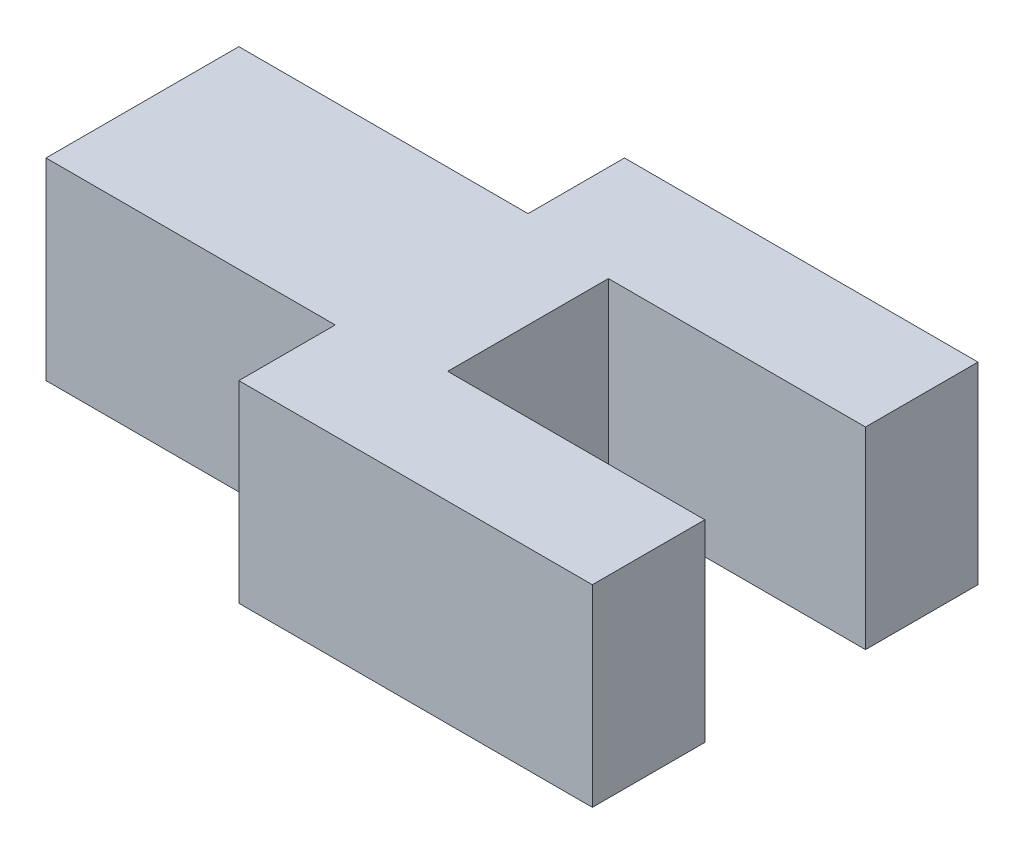
ISO-10303-21;
HEADER;
FILE_DESCRIPTION(('STEP AP214'),'2;1');
FILE_NAME('part.step','',(''),(''),'','','');
FILE_SCHEMA(('AUTOMOTIVE_DESIGN { 1 0 10303 214 1 1 1 1 }'));
ENDSEC;
DATA;
#1=APPLICATION_CONTEXT('core data for automotive mechanical design processes');
#2=APPLICATION_PROTOCOL_DEFINITION('international standard','automotive_design',2000,#1);
#3=PRODUCT_CONTEXT('',#1,'mechanical');
#4=PRODUCT('Part','Part','',(#3));
#5=PRODUCT_RELATED_PRODUCT_CATEGORY('part','',(#4));
#6=PRODUCT_DEFINITION_FORMATION('','',#4);
#7=PRODUCT_DEFINITION_CONTEXT('part definition',#1,'design');
#8=PRODUCT_DEFINITION('design','',#6,#7);
#9=PRODUCT_DEFINITION_SHAPE('','',#8);
#10=(LENGTH_UNIT() NAMED_UNIT(*) SI_UNIT(.MILLI.,.METRE.));
#11=(NAMED_UNIT(*) PLANE_ANGLE_UNIT() SI_UNIT($,.RADIAN.));
#12=(NAMED_UNIT(*) SI_UNIT($,.STERADIAN.) SOLID_ANGLE_UNIT());
#13=UNCERTAINTY_MEASURE_WITH_UNIT(LENGTH_MEASURE(1.E-05),#10,'distance_accuracy_value','');
#14=(GEOMETRIC_REPRESENTATION_CONTEXT(3) GLOBAL_UNCERTAINTY_ASSIGNED_CONTEXT((#13)) GLOBAL_UNIT_ASSIGNED_CONTEXT((#10,
#11,#12)) REPRESENTATION_CONTEXT('',''));
#15=CARTESIAN_POINT('',(0.,0.,0.));
#16=DIRECTION('',(0.,0.,1.));
#17=DIRECTION('',(1.,0.,0.));
#18=AXIS2_PLACEMENT_3D('',#15,#16,#17);
#19=CARTESIAN_POINT('',(-9.99999999999999,30.,-30.));
#20=DIRECTION('',(0.,0.,1.));
#21=DIRECTION('',(1.,0.,0.));
#22=AXIS2_PLACEMENT_3D('',#19,#20,#21);
#23=PLANE('',#22);
#24=DIRECTION('',(-1.,0.,0.));
#25=VECTOR('',#24,1.);
#26=CARTESIAN_POINT('',(-9.99999999999999,0.,-30.));
#27=LINE('',#26,#25);
#28=CARTESIAN_POINT('',(45.,0.,-30.));
#29=VERTEX_POINT('',#28);
#30=CARTESIAN_POINT('',(-9.99999999999999,0.,-30.));
#31=VERTEX_POINT('',#30);
#32=EDGE_CURVE('E153',#29,#31,#27,.T.);
#33=ORIENTED_EDGE('',*,*,#32,.T.);
#34=DIRECTION('',(0.,-1.,0.));
#35=VECTOR('',#34,1.);
#36=CARTESIAN_POINT('',(-9.99999999999999,30.,-30.));
#37=LINE('',#36,#35);
#38=CARTESIAN_POINT('',(-9.99999999999999,30.,-30.));
#39=VERTEX_POINT('',#38);
#40=EDGE_CURVE('E11',#39,#31,#37,.T.);
#41=ORIENTED_EDGE('',*,*,#40,.F.);
#42=DIRECTION('',(-1.,0.,0.));
#43=VECTOR('',#42,1.);
#44=CARTESIAN_POINT('',(-9.99999999999999,30.,-30.));
#45=LINE('',#44,#43);
#46=CARTESIAN_POINT('',(45.,30.,-30.));
#47=VERTEX_POINT('',#46);
#48=EDGE_CURVE('E175',#47,#39,#45,.T.);
#49=ORIENTED_EDGE('',*,*,#48,.F.);
#50=DIRECTION('',(0.,-1.,0.));
#51=VECTOR('',#50,1.);
#52=CARTESIAN_POINT('',(45.,30.,-30.));
#53=LINE('',#52,#51);
#54=EDGE_CURVE('E149',#47,#29,#53,.T.);
#55=ORIENTED_EDGE('',*,*,#54,.T.);
#56=EDGE_LOOP('',(#33,#41,#49,#55));
#57=FACE_BOUND('',#56,.T.);
#58=ADVANCED_FACE('F33',(#57),#23,.F.);
#59=CARTESIAN_POINT('',(-9.99999999999999,30.,-30.));
#60=DIRECTION('',(1.,0.,0.));
#61=DIRECTION('',(0.,0.,-1.));
#62=AXIS2_PLACEMENT_3D('',#59,#60,#61);
#63=PLANE('',#62);
#64=DIRECTION('',(0.,0.,1.));
#65=VECTOR('',#64,1.);
#66=CARTESIAN_POINT('',(-9.99999999999999,0.,-30.));
#67=LINE('',#66,#65);
#68=CARTESIAN_POINT('',(-9.99999999999999,0.,-15.));
#69=VERTEX_POINT('',#68);
#70=EDGE_CURVE('E156',#31,#69,#67,.T.);
#71=ORIENTED_EDGE('',*,*,#70,.T.);
#72=DIRECTION('',(0.,-1.,0.));
#73=VECTOR('',#72,1.);
#74=CARTESIAN_POINT('',(-9.99999999999999,30.,-15.));
#75=LINE('',#74,#73);
#76=CARTESIAN_POINT('',(-9.99999999999999,30.,-15.));
#77=VERTEX_POINT('',#76);
#78=EDGE_CURVE('E41',#77,#69,#75,.T.);
#79=ORIENTED_EDGE('',*,*,#78,.F.);
#80=DIRECTION('',(0.,0.,1.));
#81=VECTOR('',#80,1.);
#82=CARTESIAN_POINT('',(-9.99999999999999,30.,-30.));
#83=LINE('',#82,#81);
#84=EDGE_CURVE('E104',#39,#77,#83,.T.);
#85=ORIENTED_EDGE('',*,*,#84,.F.);
#86=ORIENTED_EDGE('',*,*,#40,.T.);
#87=EDGE_LOOP('',(#71,#79,#85,#86));
#88=FACE_BOUND('',#87,.T.);
#89=ADVANCED_FACE('F253',(#88),#63,.F.);
#90=CARTESIAN_POINT('',(-55.,30.,-15.));
#91=DIRECTION('',(0.,0.,1.));
#92=DIRECTION('',(1.,0.,0.));
#93=AXIS2_PLACEMENT_3D('',#90,#91,#92);
#94=PLANE('',#93);
#95=DIRECTION('',(-1.,0.,0.));
#96=VECTOR('',#95,1.);
#97=CARTESIAN_POINT('',(-55.,0.,-15.));
#98=LINE('',#97,#96);
#99=CARTESIAN_POINT('',(-55.,0.,-15.));
#100=VERTEX_POINT('',#99);
#101=EDGE_CURVE('E158',#69,#100,#98,.T.);
#102=ORIENTED_EDGE('',*,*,#101,.T.);
#103=DIRECTION('',(0.,-1.,0.));
#104=VECTOR('',#103,1.);
#105=CARTESIAN_POINT('',(-55.,30.,-15.));
#106=LINE('',#105,#104);
#107=CARTESIAN_POINT('',(-55.,30.,-15.));
#108=VERTEX_POINT('',#107);
#109=EDGE_CURVE('E194',#108,#100,#106,.T.);
#110=ORIENTED_EDGE('',*,*,#109,.F.);
#111=DIRECTION('',(-1.,0.,0.));
#112=VECTOR('',#111,1.);
#113=CARTESIAN_POINT('',(-55.,30.,-15.));
#114=LINE('',#113,#112);
#115=EDGE_CURVE('E202',#77,#108,#114,.T.);
#116=ORIENTED_EDGE('',*,*,#115,.F.);
#117=ORIENTED_EDGE('',*,*,#78,.T.);
#118=EDGE_LOOP('',(#102,#110,#116,#117));
#119=FACE_BOUND('',#118,.T.);
#120=ADVANCED_FACE('F200',(#119),#94,.F.);
#121=CARTESIAN_POINT('',(-55.,30.,15.));
#122=DIRECTION('',(1.,0.,0.));
#123=DIRECTION('',(0.,0.,-1.));
#124=AXIS2_PLACEMENT_3D('',#121,#122,#123);
#125=PLANE('',#124);
#126=DIRECTION('',(0.,0.,1.));
#127=VECTOR('',#126,1.);
#128=CARTESIAN_POINT('',(-55.,0.,15.));
#129=LINE('',#128,#127);
#130=CARTESIAN_POINT('',(-55.,0.,15.));
#131=VERTEX_POINT('',#130);
#132=EDGE_CURVE('E160',#100,#131,#129,.T.);
#133=ORIENTED_EDGE('',*,*,#132,.T.);
#134=DIRECTION('',(0.,-1.,0.));
#135=VECTOR('',#134,1.);
#136=CARTESIAN_POINT('',(-55.,30.,15.));
#137=LINE('',#136,#135);
#138=CARTESIAN_POINT('',(-55.,30.,15.));
#139=VERTEX_POINT('',#138);
#140=EDGE_CURVE('E191',#139,#131,#137,.T.);
#141=ORIENTED_EDGE('',*,*,#140,.F.);
#142=DIRECTION('',(0.,0.,1.));
#143=VECTOR('',#142,1.);
#144=CARTESIAN_POINT('',(-55.,30.,15.));
#145=LINE('',#144,#143);
#146=EDGE_CURVE('E220',#108,#139,#145,.T.);
#147=ORIENTED_EDGE('',*,*,#146,.F.);
#148=ORIENTED_EDGE('',*,*,#109,.T.);
#149=EDGE_LOOP('',(#133,#141,#147,#148));
#150=FACE_BOUND('',#149,.T.);
#151=ADVANCED_FACE('F211',(#150),#125,.F.);
#152=CARTESIAN_POINT('',(-55.,30.,15.));
#153=DIRECTION('',(0.,0.,-1.));
#154=DIRECTION('',(-1.,0.,0.));
#155=AXIS2_PLACEMENT_3D('',#152,#153,#154);
#156=PLANE('',#155);
#157=DIRECTION('',(1.,0.,0.));
#158=VECTOR('',#157,1.);
#159=CARTESIAN_POINT('',(-55.,0.,15.));
#160=LINE('',#159,#158);
#161=CARTESIAN_POINT('',(-9.99999999999999,0.,15.));
#162=VERTEX_POINT('',#161);
#163=EDGE_CURVE('E162',#131,#162,#160,.T.);
#164=ORIENTED_EDGE('',*,*,#163,.T.);
#165=DIRECTION('',(0.,-1.,0.));
#166=VECTOR('',#165,1.);
#167=CARTESIAN_POINT('',(-9.99999999999999,30.,15.));
#168=LINE('',#167,#166);
#169=CARTESIAN_POINT('',(-9.99999999999999,30.,15.));
#170=VERTEX_POINT('',#169);
#171=EDGE_CURVE('E188',#170,#162,#168,.T.);
#172=ORIENTED_EDGE('',*,*,#171,.F.);
#173=DIRECTION('',(1.,0.,0.));
#174=VECTOR('',#173,1.);
#175=CARTESIAN_POINT('',(-55.,30.,15.));
#176=LINE('',#175,#174);
#177=EDGE_CURVE('E217',#139,#170,#176,.T.);
#178=ORIENTED_EDGE('',*,*,#177,.F.);
#179=ORIENTED_EDGE('',*,*,#140,.T.);
#180=EDGE_LOOP('',(#164,#172,#178,#179));
#181=FACE_BOUND('',#180,.T.);
#182=ADVANCED_FACE('F215',(#181),#156,.F.);
#183=CARTESIAN_POINT('',(-9.99999999999999,30.,30.));
#184=DIRECTION('',(1.,0.,0.));
#185=DIRECTION('',(0.,0.,-1.));
#186=AXIS2_PLACEMENT_3D('',#183,#184,#185);
#187=PLANE('',#186);
#188=DIRECTION('',(0.,0.,1.));
#189=VECTOR('',#188,1.);
#190=CARTESIAN_POINT('',(-9.99999999999999,0.,30.));
#191=LINE('',#190,#189);
#192=CARTESIAN_POINT('',(-9.99999999999999,0.,30.));
#193=VERTEX_POINT('',#192);
#194=EDGE_CURVE('E164',#162,#193,#191,.T.);
#195=ORIENTED_EDGE('',*,*,#194,.T.);
#196=DIRECTION('',(0.,-1.,0.));
#197=VECTOR('',#196,1.);
#198=CARTESIAN_POINT('',(-9.99999999999999,30.,30.));
#199=LINE('',#198,#197);
#200=CARTESIAN_POINT('',(-9.99999999999999,30.,30.));
#201=VERTEX_POINT('',#200);
#202=EDGE_CURVE('E185',#201,#193,#199,.T.);
#203=ORIENTED_EDGE('',*,*,#202,.F.);
#204=DIRECTION('',(0.,0.,1.));
#205=VECTOR('',#204,1.);
#206=CARTESIAN_POINT('',(-9.99999999999999,30.,30.));
#207=LINE('',#206,#205);
#208=EDGE_CURVE('E219',#170,#201,#207,.T.);
#209=ORIENTED_EDGE('',*,*,#208,.F.);
#210=ORIENTED_EDGE('',*,*,#171,.T.);
#211=EDGE_LOOP('',(#195,#203,#209,#210));
#212=FACE_BOUND('',#211,.T.);
#213=ADVANCED_FACE('F266',(#212),#187,.F.);
#214=CARTESIAN_POINT('',(-9.99999999999999,30.,30.));
#215=DIRECTION('',(0.,0.,-1.));
#216=DIRECTION('',(-1.,0.,0.));
#217=AXIS2_PLACEMENT_3D('',#214,#215,#216);
#218=PLANE('',#217);
#219=DIRECTION('',(1.,0.,0.));
#220=VECTOR('',#219,1.);
#221=CARTESIAN_POINT('',(-9.99999999999999,0.,30.));
#222=LINE('',#221,#220);
#223=CARTESIAN_POINT('',(45.,0.,30.));
#224=VERTEX_POINT('',#223);
#225=EDGE_CURVE('E166',#193,#224,#222,.T.);
#226=ORIENTED_EDGE('',*,*,#225,.T.);
#227=DIRECTION('',(0.,-1.,0.));
#228=VECTOR('',#227,1.);
#229=CARTESIAN_POINT('',(45.,30.,30.));
#230=LINE('',#229,#228);
#231=CARTESIAN_POINT('',(45.,30.,30.));
#232=VERTEX_POINT('',#231);
#233=EDGE_CURVE('E182',#232,#224,#230,.T.);
#234=ORIENTED_EDGE('',*,*,#233,.F.);
#235=DIRECTION('',(1.,0.,0.));
#236=VECTOR('',#235,1.);
#237=CARTESIAN_POINT('',(-9.99999999999999,30.,30.));
#238=LINE('',#237,#236);
#239=EDGE_CURVE('E222',#201,#232,#238,.T.);
#240=ORIENTED_EDGE('',*,*,#239,.F.);
#241=ORIENTED_EDGE('',*,*,#202,.T.);
#242=EDGE_LOOP('',(#226,#234,#240,#241));
#243=FACE_BOUND('',#242,.T.);
#244=ADVANCED_FACE('F269',(#243),#218,.F.);
#245=CARTESIAN_POINT('',(45.,30.,30.));
#246=DIRECTION('',(-1.,0.,0.));
#247=DIRECTION('',(0.,0.,1.));
#248=AXIS2_PLACEMENT_3D('',#245,#246,#247);
#249=PLANE('',#248);
#250=DIRECTION('',(0.,0.,-1.));
#251=VECTOR('',#250,1.);
#252=CARTESIAN_POINT('',(45.,0.,30.));
#253=LINE('',#252,#251);
#254=CARTESIAN_POINT('',(45.,0.,12.5));
#255=VERTEX_POINT('',#254);
#256=EDGE_CURVE('E168',#224,#255,#253,.T.);
#257=ORIENTED_EDGE('',*,*,#256,.T.);
#258=DIRECTION('',(0.,-1.,0.));
#259=VECTOR('',#258,1.);
#260=CARTESIAN_POINT('',(45.,30.,12.5));
#261=LINE('',#260,#259);
#262=CARTESIAN_POINT('',(45.,30.,12.5));
#263=VERTEX_POINT('',#262);
#264=EDGE_CURVE('E179',#263,#255,#261,.T.);
#265=ORIENTED_EDGE('',*,*,#264,.F.);
#266=DIRECTION('',(0.,0.,-1.));
#267=VECTOR('',#266,1.);
#268=CARTESIAN_POINT('',(45.,30.,30.));
#269=LINE('',#268,#267);
#270=EDGE_CURVE('E228',#232,#263,#269,.T.);
#271=ORIENTED_EDGE('',*,*,#270,.F.);
#272=ORIENTED_EDGE('',*,*,#233,.T.);
#273=EDGE_LOOP('',(#257,#265,#271,#272));
#274=FACE_BOUND('',#273,.T.);
#275=ADVANCED_FACE('F234',(#274),#249,.F.);
#276=CARTESIAN_POINT('',(45.,30.,12.5));
#277=DIRECTION('',(0.,0.,1.));
#278=DIRECTION('',(1.,0.,0.));
#279=AXIS2_PLACEMENT_3D('',#276,#277,#278);
#280=PLANE('',#279);
#281=DIRECTION('',(-1.,0.,0.));
#282=VECTOR('',#281,1.);
#283=CARTESIAN_POINT('',(45.,0.,12.5));
#284=LINE('',#283,#282);
#285=CARTESIAN_POINT('',(5.00000000000001,0.,12.5));
#286=VERTEX_POINT('',#285);
#287=EDGE_CURVE('E170',#255,#286,#284,.T.);
#288=ORIENTED_EDGE('',*,*,#287,.T.);
#289=DIRECTION('',(0.,-1.,0.));
#290=VECTOR('',#289,1.);
#291=CARTESIAN_POINT('',(5.00000000000001,30.,12.5));
#292=LINE('',#291,#290);
#293=CARTESIAN_POINT('',(5.00000000000001,30.,12.5));
#294=VERTEX_POINT('',#293);
#295=EDGE_CURVE('E144',#294,#286,#292,.T.);
#296=ORIENTED_EDGE('',*,*,#295,.F.);
#297=DIRECTION('',(-1.,0.,0.));
#298=VECTOR('',#297,1.);
#299=CARTESIAN_POINT('',(45.,30.,12.5));
#300=LINE('',#299,#298);
#301=EDGE_CURVE('E135',#263,#294,#300,.T.);
#302=ORIENTED_EDGE('',*,*,#301,.F.);
#303=ORIENTED_EDGE('',*,*,#264,.T.);
#304=EDGE_LOOP('',(#288,#296,#302,#303));
#305=FACE_BOUND('',#304,.T.);
#306=ADVANCED_FACE('F238',(#305),#280,.F.);
#307=CARTESIAN_POINT('',(5.00000000000001,30.,12.5));
#308=DIRECTION('',(-1.,0.,0.));
#309=DIRECTION('',(0.,0.,1.));
#310=AXIS2_PLACEMENT_3D('',#307,#308,#309);
#311=PLANE('',#310);
#312=DIRECTION('',(0.,0.,-1.));
#313=VECTOR('',#312,1.);
#314=CARTESIAN_POINT('',(5.00000000000001,0.,12.5));
#315=LINE('',#314,#313);
#316=CARTESIAN_POINT('',(5.00000000000001,0.,-12.5));
#317=VERTEX_POINT('',#316);
#318=EDGE_CURVE('E143',#286,#317,#315,.T.);
#319=ORIENTED_EDGE('',*,*,#318,.T.);
#320=DIRECTION('',(0.,-1.,0.));
#321=VECTOR('',#320,1.);
#322=CARTESIAN_POINT('',(5.00000000000001,30.,-12.5));
#323=LINE('',#322,#321);
#324=CARTESIAN_POINT('',(5.00000000000001,30.,-12.5));
#325=VERTEX_POINT('',#324);
#326=EDGE_CURVE('E140',#325,#317,#323,.T.);
#327=ORIENTED_EDGE('',*,*,#326,.F.);
#328=DIRECTION('',(0.,0.,-1.));
#329=VECTOR('',#328,1.);
#330=CARTESIAN_POINT('',(5.00000000000001,30.,12.5));
#331=LINE('',#330,#329);
#332=EDGE_CURVE('E129',#294,#325,#331,.T.);
#333=ORIENTED_EDGE('',*,*,#332,.F.);
#334=ORIENTED_EDGE('',*,*,#295,.T.);
#335=EDGE_LOOP('',(#319,#327,#333,#334));
#336=FACE_BOUND('',#335,.T.);
#337=ADVANCED_FACE('F141',(#336),#311,.F.);
#338=CARTESIAN_POINT('',(45.,30.,-12.5));
#339=DIRECTION('',(0.,0.,-1.));
#340=DIRECTION('',(-1.,0.,0.));
#341=AXIS2_PLACEMENT_3D('',#338,#339,#340);
#342=PLANE('',#341);
#343=DIRECTION('',(1.,0.,0.));
#344=VECTOR('',#343,1.);
#345=CARTESIAN_POINT('',(45.,0.,-12.5));
#346=LINE('',#345,#344);
#347=CARTESIAN_POINT('',(45.,0.,-12.5));
#348=VERTEX_POINT('',#347);
#349=EDGE_CURVE('E90',#317,#348,#346,.T.);
#350=ORIENTED_EDGE('',*,*,#349,.T.);
#351=DIRECTION('',(0.,-1.,0.));
#352=VECTOR('',#351,1.);
#353=CARTESIAN_POINT('',(45.,30.,-12.5));
#354=LINE('',#353,#352);
#355=CARTESIAN_POINT('',(45.,30.,-12.5));
#356=VERTEX_POINT('',#355);
#357=EDGE_CURVE('E145',#356,#348,#354,.T.);
#358=ORIENTED_EDGE('',*,*,#357,.F.);
#359=DIRECTION('',(1.,0.,0.));
#360=VECTOR('',#359,1.);
#361=CARTESIAN_POINT('',(45.,30.,-12.5));
#362=LINE('',#361,#360);
#363=EDGE_CURVE('E133',#325,#356,#362,.T.);
#364=ORIENTED_EDGE('',*,*,#363,.F.);
#365=ORIENTED_EDGE('',*,*,#326,.T.);
#366=EDGE_LOOP('',(#350,#358,#364,#365));
#367=FACE_BOUND('',#366,.T.);
#368=ADVANCED_FACE('F147',(#367),#342,.F.);
#369=CARTESIAN_POINT('',(45.,30.,-12.5));
#370=DIRECTION('',(-1.,0.,0.));
#371=DIRECTION('',(0.,0.,1.));
#372=AXIS2_PLACEMENT_3D('',#369,#370,#371);
#373=PLANE('',#372);
#374=DIRECTION('',(0.,0.,-1.));
#375=VECTOR('',#374,1.);
#376=CARTESIAN_POINT('',(45.,0.,-12.5));
#377=LINE('',#376,#375);
#378=EDGE_CURVE('E96',#348,#29,#377,.T.);
#379=ORIENTED_EDGE('',*,*,#378,.T.);
#380=ORIENTED_EDGE('',*,*,#54,.F.);
#381=DIRECTION('',(0.,0.,-1.));
#382=VECTOR('',#381,1.);
#383=CARTESIAN_POINT('',(45.,30.,-12.5));
#384=LINE('',#383,#382);
#385=EDGE_CURVE('E49',#356,#47,#384,.T.);
#386=ORIENTED_EDGE('',*,*,#385,.F.);
#387=ORIENTED_EDGE('',*,*,#357,.T.);
#388=EDGE_LOOP('',(#379,#380,#386,#387));
#389=FACE_BOUND('',#388,.T.);
#390=ADVANCED_FACE('F242',(#389),#373,.F.);
#391=CARTESIAN_POINT('',(0.,30.,0.));
#392=DIRECTION('',(0.,1.,0.));
#393=DIRECTION('',(0.,0.,1.));
#394=AXIS2_PLACEMENT_3D('',#391,#392,#393);
#395=PLANE('',#394);
#396=ORIENTED_EDGE('',*,*,#48,.T.);
#397=ORIENTED_EDGE('',*,*,#84,.T.);
#398=ORIENTED_EDGE('',*,*,#115,.T.);
#399=ORIENTED_EDGE('',*,*,#146,.T.);
#400=ORIENTED_EDGE('',*,*,#177,.T.);
#401=ORIENTED_EDGE('',*,*,#208,.T.);
#402=ORIENTED_EDGE('',*,*,#239,.T.);
#403=ORIENTED_EDGE('',*,*,#270,.T.);
#404=ORIENTED_EDGE('',*,*,#301,.T.);
#405=ORIENTED_EDGE('',*,*,#332,.T.);
#406=ORIENTED_EDGE('',*,*,#363,.T.);
#407=ORIENTED_EDGE('',*,*,#385,.T.);
#408=EDGE_LOOP('',(#396,#397,#398,#399,#400,#401,#402,#403,#404,#405,#406,#407));
#409=FACE_BOUND('',#408,.T.);
#410=ADVANCED_FACE('F131',(#409),#395,.T.);
#411=CARTESIAN_POINT('',(0.,0.,0.));
#412=DIRECTION('',(0.,1.,0.));
#413=DIRECTION('',(0.,0.,1.));
#414=AXIS2_PLACEMENT_3D('',#411,#412,#413);
#415=PLANE('',#414);
#416=ORIENTED_EDGE('',*,*,#32,.F.);
#417=ORIENTED_EDGE('',*,*,#378,.F.);
#418=ORIENTED_EDGE('',*,*,#349,.F.);
#419=ORIENTED_EDGE('',*,*,#318,.F.);
#420=ORIENTED_EDGE('',*,*,#287,.F.);
#421=ORIENTED_EDGE('',*,*,#256,.F.);
#422=ORIENTED_EDGE('',*,*,#225,.F.);
#423=ORIENTED_EDGE('',*,*,#194,.F.);
#424=ORIENTED_EDGE('',*,*,#163,.F.);
#425=ORIENTED_EDGE('',*,*,#132,.F.);
#426=ORIENTED_EDGE('',*,*,#101,.F.);
#427=ORIENTED_EDGE('',*,*,#70,.F.);
#428=EDGE_LOOP('',(#416,#417,#418,#419,#420,#421,#422,#423,#424,#425,#426,#427));
#429=FACE_BOUND('',#428,.T.);
#430=ADVANCED_FACE('F206',(#429),#415,.F.);
#431=CLOSED_SHELL('',(#58,#89,#120,#151,#182,#213,#244,#275,#306,#337,#368,#390,#410,#430));
#432=MANIFOLD_SOLID_BREP('B2',#431);
#433=ADVANCED_BREP_SHAPE_REPRESENTATION('',(#18,#432),#14);
#434=SHAPE_DEFINITION_REPRESENTATION(#9,#433);
ENDSEC;
END-ISO-10303-21;
